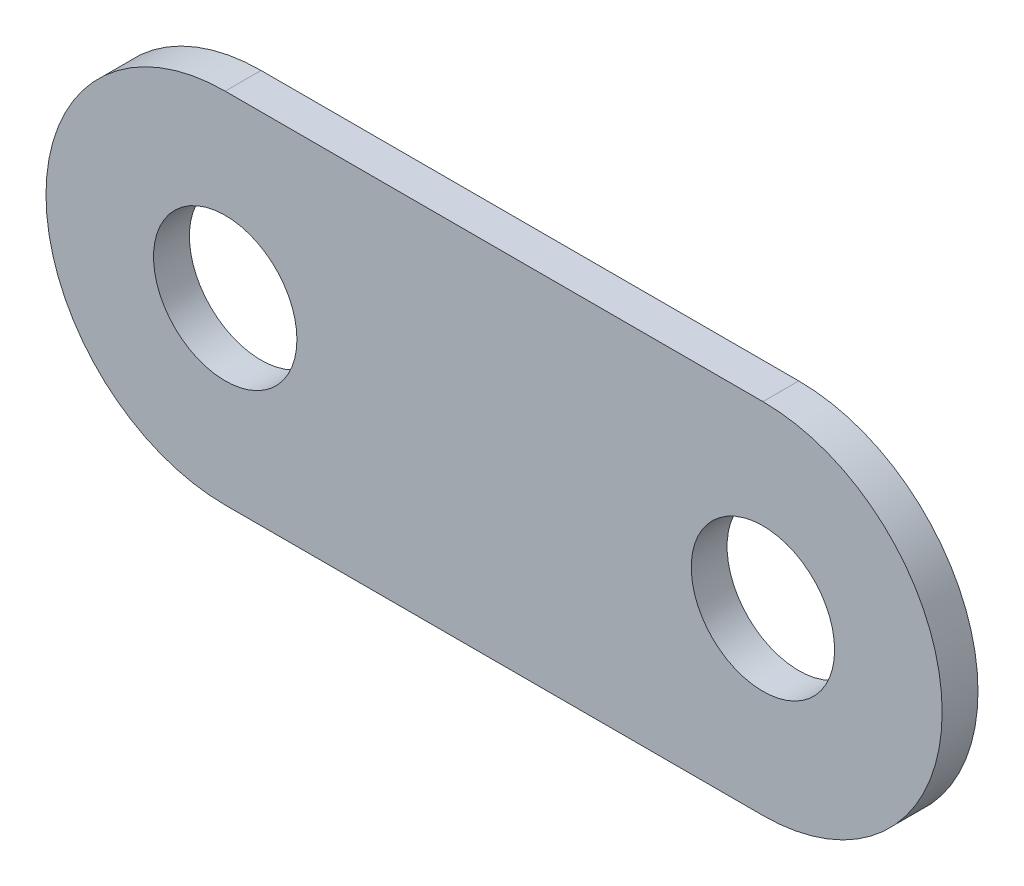
ISO-10303-21;
HEADER;
FILE_DESCRIPTION(('STEP AP214'),'2;1');
FILE_NAME('part.step','',(''),(''),'','','');
FILE_SCHEMA(('AUTOMOTIVE_DESIGN { 1 0 10303 214 1 1 1 1 }'));
ENDSEC;
DATA;
#1=APPLICATION_CONTEXT('core data for automotive mechanical design processes');
#2=APPLICATION_PROTOCOL_DEFINITION('international standard','automotive_design',2000,#1);
#3=PRODUCT_CONTEXT('',#1,'mechanical');
#4=PRODUCT('Part','Part','',(#3));
#5=PRODUCT_RELATED_PRODUCT_CATEGORY('part','',(#4));
#6=PRODUCT_DEFINITION_FORMATION('','',#4);
#7=PRODUCT_DEFINITION_CONTEXT('part definition',#1,'design');
#8=PRODUCT_DEFINITION('design','',#6,#7);
#9=PRODUCT_DEFINITION_SHAPE('','',#8);
#10=(LENGTH_UNIT() NAMED_UNIT(*) SI_UNIT(.MILLI.,.METRE.));
#11=(NAMED_UNIT(*) PLANE_ANGLE_UNIT() SI_UNIT($,.RADIAN.));
#12=(NAMED_UNIT(*) SI_UNIT($,.STERADIAN.) SOLID_ANGLE_UNIT());
#13=UNCERTAINTY_MEASURE_WITH_UNIT(LENGTH_MEASURE(1.E-05),#10,'distance_accuracy_value','');
#14=(GEOMETRIC_REPRESENTATION_CONTEXT(3) GLOBAL_UNCERTAINTY_ASSIGNED_CONTEXT((#13)) GLOBAL_UNIT_ASSIGNED_CONTEXT((#10,
#11,#12)) REPRESENTATION_CONTEXT('',''));
#15=CARTESIAN_POINT('',(0.,0.,0.));
#16=DIRECTION('',(0.,0.,1.));
#17=DIRECTION('',(1.,0.,0.));
#18=AXIS2_PLACEMENT_3D('',#15,#16,#17);
#19=CARTESIAN_POINT('',(5.,-5.,1.));
#20=DIRECTION('',(0.,0.,1.));
#21=DIRECTION('',(1.,0.,0.));
#22=AXIS2_PLACEMENT_3D('',#19,#20,#21);
#23=PLANE('',#22);
#24=CARTESIAN_POINT('',(5.,-5.,1.));
#25=DIRECTION('',(0.,0.,1.));
#26=DIRECTION('',(1.,0.,0.));
#27=AXIS2_PLACEMENT_3D('',#24,#25,#26);
#28=CIRCLE('',#27,2.00000000000001);
#29=CARTESIAN_POINT('',(7.00000000000001,-5.,1.));
#30=VERTEX_POINT('',#29);
#31=EDGE_CURVE('E101',#30,#30,#28,.T.);
#32=ORIENTED_EDGE('',*,*,#31,.F.);
#33=EDGE_LOOP('',(#32));
#34=FACE_BOUND('',#33,.T.);
#35=CARTESIAN_POINT('',(5.,-5.,1.));
#36=DIRECTION('',(0.,0.,1.));
#37=DIRECTION('',(1.,0.,0.));
#38=AXIS2_PLACEMENT_3D('',#35,#36,#37);
#39=CIRCLE('',#38,5.);
#40=CARTESIAN_POINT('',(5.,0.,1.));
#41=VERTEX_POINT('',#40);
#42=CARTESIAN_POINT('',(5.,-10.,1.));
#43=VERTEX_POINT('',#42);
#44=EDGE_CURVE('E80',#41,#43,#39,.T.);
#45=ORIENTED_EDGE('',*,*,#44,.T.);
#46=DIRECTION('',(1.,0.,0.));
#47=VECTOR('',#46,1.);
#48=CARTESIAN_POINT('',(20.,-10.,1.));
#49=LINE('',#48,#47);
#50=CARTESIAN_POINT('',(20.,-10.,1.));
#51=VERTEX_POINT('',#50);
#52=EDGE_CURVE('E83',#43,#51,#49,.T.);
#53=ORIENTED_EDGE('',*,*,#52,.T.);
#54=CARTESIAN_POINT('',(20.,-4.99999999999999,1.));
#55=DIRECTION('',(0.,0.,1.));
#56=DIRECTION('',(-1.,0.,0.));
#57=AXIS2_PLACEMENT_3D('',#54,#55,#56);
#58=CIRCLE('',#57,5.00000000000001);
#59=CARTESIAN_POINT('',(20.,0.,1.));
#60=VERTEX_POINT('',#59);
#61=EDGE_CURVE('E87',#51,#60,#58,.T.);
#62=ORIENTED_EDGE('',*,*,#61,.T.);
#63=DIRECTION('',(-1.,0.,0.));
#64=VECTOR('',#63,1.);
#65=CARTESIAN_POINT('',(5.,0.,1.));
#66=LINE('',#65,#64);
#67=EDGE_CURVE('E52',#60,#41,#66,.T.);
#68=ORIENTED_EDGE('',*,*,#67,.T.);
#69=EDGE_LOOP('',(#45,#53,#62,#68));
#70=FACE_BOUND('',#69,.T.);
#71=CARTESIAN_POINT('',(20.,-5.,1.));
#72=DIRECTION('',(0.,0.,1.));
#73=DIRECTION('',(1.,0.,0.));
#74=AXIS2_PLACEMENT_3D('',#71,#72,#73);
#75=CIRCLE('',#74,2.);
#76=CARTESIAN_POINT('',(22.,-5.,1.));
#77=VERTEX_POINT('',#76);
#78=EDGE_CURVE('E122',#77,#77,#75,.T.);
#79=ORIENTED_EDGE('',*,*,#78,.F.);
#80=EDGE_LOOP('',(#79));
#81=FACE_BOUND('',#80,.T.);
#82=ADVANCED_FACE('F35',(#34,#70,#81),#23,.T.);
#83=CARTESIAN_POINT('',(5.,-5.,0.));
#84=DIRECTION('',(0.,0.,1.));
#85=DIRECTION('',(1.,0.,0.));
#86=AXIS2_PLACEMENT_3D('',#83,#84,#85);
#87=PLANE('',#86);
#88=CARTESIAN_POINT('',(5.00000000000002,-4.99999999999998,0.));
#89=DIRECTION('',(0.,0.,1.));
#90=DIRECTION('',(-1.,0.,0.));
#91=AXIS2_PLACEMENT_3D('',#88,#89,#90);
#92=CIRCLE('',#91,5.00000000000002);
#93=CARTESIAN_POINT('',(5.,0.,0.));
#94=VERTEX_POINT('',#93);
#95=CARTESIAN_POINT('',(5.,-10.,0.));
#96=VERTEX_POINT('',#95);
#97=EDGE_CURVE('E75',#94,#96,#92,.T.);
#98=ORIENTED_EDGE('',*,*,#97,.F.);
#99=DIRECTION('',(-1.,0.,0.));
#100=VECTOR('',#99,1.);
#101=CARTESIAN_POINT('',(5.,0.,0.));
#102=LINE('',#101,#100);
#103=CARTESIAN_POINT('',(20.,0.,0.));
#104=VERTEX_POINT('',#103);
#105=EDGE_CURVE('E104',#104,#94,#102,.T.);
#106=ORIENTED_EDGE('',*,*,#105,.F.);
#107=CARTESIAN_POINT('',(20.,-5.,0.));
#108=DIRECTION('',(0.,0.,1.));
#109=DIRECTION('',(-1.,0.,0.));
#110=AXIS2_PLACEMENT_3D('',#107,#108,#109);
#111=CIRCLE('',#110,5.);
#112=CARTESIAN_POINT('',(20.,-10.,0.));
#113=VERTEX_POINT('',#112);
#114=EDGE_CURVE('E68',#113,#104,#111,.T.);
#115=ORIENTED_EDGE('',*,*,#114,.F.);
#116=DIRECTION('',(1.,0.,0.));
#117=VECTOR('',#116,1.);
#118=CARTESIAN_POINT('',(20.,-10.,0.));
#119=LINE('',#118,#117);
#120=EDGE_CURVE('E92',#96,#113,#119,.T.);
#121=ORIENTED_EDGE('',*,*,#120,.F.);
#122=EDGE_LOOP('',(#98,#106,#115,#121));
#123=FACE_BOUND('',#122,.T.);
#124=CARTESIAN_POINT('',(5.,-5.,0.));
#125=DIRECTION('',(0.,0.,1.));
#126=DIRECTION('',(1.,0.,0.));
#127=AXIS2_PLACEMENT_3D('',#124,#125,#126);
#128=CIRCLE('',#127,2.00000000000001);
#129=CARTESIAN_POINT('',(7.00000000000001,-5.,0.));
#130=VERTEX_POINT('',#129);
#131=EDGE_CURVE('E117',#130,#130,#128,.T.);
#132=ORIENTED_EDGE('',*,*,#131,.T.);
#133=EDGE_LOOP('',(#132));
#134=FACE_BOUND('',#133,.T.);
#135=CARTESIAN_POINT('',(20.,-5.,0.));
#136=DIRECTION('',(0.,0.,1.));
#137=DIRECTION('',(1.,0.,0.));
#138=AXIS2_PLACEMENT_3D('',#135,#136,#137);
#139=CIRCLE('',#138,2.);
#140=CARTESIAN_POINT('',(22.,-5.,0.));
#141=VERTEX_POINT('',#140);
#142=EDGE_CURVE('E120',#141,#141,#139,.T.);
#143=ORIENTED_EDGE('',*,*,#142,.T.);
#144=EDGE_LOOP('',(#143));
#145=FACE_BOUND('',#144,.T.);
#146=ADVANCED_FACE('F110',(#123,#134,#145),#87,.F.);
#147=CARTESIAN_POINT('',(5.00000000000002,-4.99999999999998,1.));
#148=DIRECTION('',(0.,0.,-1.));
#149=DIRECTION('',(-1.,0.,0.));
#150=AXIS2_PLACEMENT_3D('',#147,#148,#149);
#151=CYLINDRICAL_SURFACE('',#150,5.00000000000002);
#152=ORIENTED_EDGE('',*,*,#97,.T.);
#153=DIRECTION('',(0.,0.,-1.));
#154=VECTOR('',#153,1.);
#155=CARTESIAN_POINT('',(5.,-10.,1.));
#156=LINE('',#155,#154);
#157=EDGE_CURVE('E11',#43,#96,#156,.T.);
#158=ORIENTED_EDGE('',*,*,#157,.F.);
#159=ORIENTED_EDGE('',*,*,#44,.F.);
#160=DIRECTION('',(0.,0.,-1.));
#161=VECTOR('',#160,1.);
#162=CARTESIAN_POINT('',(5.,0.,1.));
#163=LINE('',#162,#161);
#164=EDGE_CURVE('E96',#41,#94,#163,.T.);
#165=ORIENTED_EDGE('',*,*,#164,.T.);
#166=EDGE_LOOP('',(#152,#158,#159,#165));
#167=FACE_BOUND('',#166,.T.);
#168=ADVANCED_FACE('F37',(#167),#151,.T.);
#169=CARTESIAN_POINT('',(20.,-10.,1.));
#170=DIRECTION('',(0.,1.,0.));
#171=DIRECTION('',(0.,0.,1.));
#172=AXIS2_PLACEMENT_3D('',#169,#170,#171);
#173=PLANE('',#172);
#174=ORIENTED_EDGE('',*,*,#120,.T.);
#175=DIRECTION('',(0.,0.,-1.));
#176=VECTOR('',#175,1.);
#177=CARTESIAN_POINT('',(20.,-10.,1.));
#178=LINE('',#177,#176);
#179=EDGE_CURVE('E44',#51,#113,#178,.T.);
#180=ORIENTED_EDGE('',*,*,#179,.F.);
#181=ORIENTED_EDGE('',*,*,#52,.F.);
#182=ORIENTED_EDGE('',*,*,#157,.T.);
#183=EDGE_LOOP('',(#174,#180,#181,#182));
#184=FACE_BOUND('',#183,.T.);
#185=ADVANCED_FACE('F91',(#184),#173,.F.);
#186=CARTESIAN_POINT('',(20.,-5.,1.));
#187=DIRECTION('',(0.,0.,-1.));
#188=DIRECTION('',(-1.,0.,0.));
#189=AXIS2_PLACEMENT_3D('',#186,#187,#188);
#190=CYLINDRICAL_SURFACE('',#189,5.);
#191=ORIENTED_EDGE('',*,*,#114,.T.);
#192=DIRECTION('',(0.,0.,-1.));
#193=VECTOR('',#192,1.);
#194=CARTESIAN_POINT('',(20.,0.,1.));
#195=LINE('',#194,#193);
#196=EDGE_CURVE('E93',#60,#104,#195,.T.);
#197=ORIENTED_EDGE('',*,*,#196,.F.);
#198=ORIENTED_EDGE('',*,*,#61,.F.);
#199=ORIENTED_EDGE('',*,*,#179,.T.);
#200=EDGE_LOOP('',(#191,#197,#198,#199));
#201=FACE_BOUND('',#200,.T.);
#202=ADVANCED_FACE('F94',(#201),#190,.T.);
#203=CARTESIAN_POINT('',(5.,0.,1.));
#204=DIRECTION('',(0.,-1.,0.));
#205=DIRECTION('',(0.,0.,-1.));
#206=AXIS2_PLACEMENT_3D('',#203,#204,#205);
#207=PLANE('',#206);
#208=ORIENTED_EDGE('',*,*,#105,.T.);
#209=ORIENTED_EDGE('',*,*,#164,.F.);
#210=ORIENTED_EDGE('',*,*,#67,.F.);
#211=ORIENTED_EDGE('',*,*,#196,.T.);
#212=EDGE_LOOP('',(#208,#209,#210,#211));
#213=FACE_BOUND('',#212,.T.);
#214=ADVANCED_FACE('F109',(#213),#207,.F.);
#215=CARTESIAN_POINT('',(5.,-5.,1.));
#216=DIRECTION('',(0.,0.,-1.));
#217=DIRECTION('',(-1.,0.,0.));
#218=AXIS2_PLACEMENT_3D('',#215,#216,#217);
#219=CYLINDRICAL_SURFACE('',#218,2.00000000000001);
#220=ORIENTED_EDGE('',*,*,#31,.T.);
#221=EDGE_LOOP('',(#220));
#222=FACE_BOUND('',#221,.T.);
#223=ORIENTED_EDGE('',*,*,#131,.F.);
#224=EDGE_LOOP('',(#223));
#225=FACE_BOUND('',#224,.T.);
#226=ADVANCED_FACE('F131',(#222,#225),#219,.F.);
#227=CARTESIAN_POINT('',(20.,-5.,1.));
#228=DIRECTION('',(0.,0.,-1.));
#229=DIRECTION('',(-1.,0.,0.));
#230=AXIS2_PLACEMENT_3D('',#227,#228,#229);
#231=CYLINDRICAL_SURFACE('',#230,2.);
#232=ORIENTED_EDGE('',*,*,#78,.T.);
#233=EDGE_LOOP('',(#232));
#234=FACE_BOUND('',#233,.T.);
#235=ORIENTED_EDGE('',*,*,#142,.F.);
#236=EDGE_LOOP('',(#235));
#237=FACE_BOUND('',#236,.T.);
#238=ADVANCED_FACE('F191',(#234,#237),#231,.F.);
#239=CLOSED_SHELL('',(#82,#146,#168,#185,#202,#214,#226,#238));
#240=MANIFOLD_SOLID_BREP('B2',#239);
#241=ADVANCED_BREP_SHAPE_REPRESENTATION('',(#18,#240),#14);
#242=SHAPE_DEFINITION_REPRESENTATION(#9,#241);
ENDSEC;
END-ISO-10303-21;
